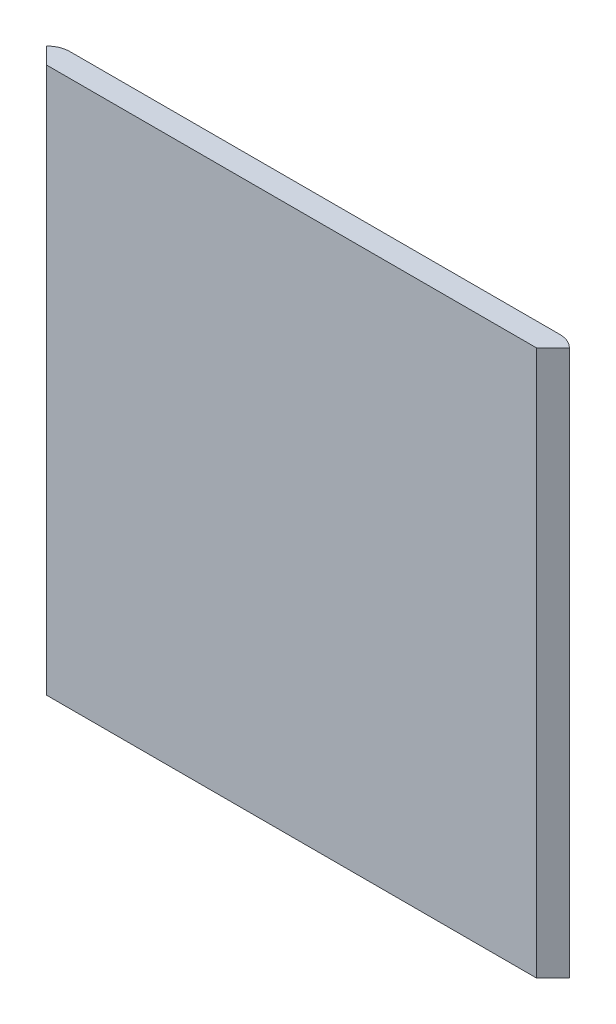
ISO-10303-21;
HEADER;
FILE_DESCRIPTION(('STEP AP214'),'2;1');
FILE_NAME('part.step','',(''),(''),'','','');
FILE_SCHEMA(('AUTOMOTIVE_DESIGN { 1 0 10303 214 1 1 1 1 }'));
ENDSEC;
DATA;
#1=APPLICATION_CONTEXT('core data for automotive mechanical design processes');
#2=APPLICATION_PROTOCOL_DEFINITION('international standard','automotive_design',2000,#1);
#3=PRODUCT_CONTEXT('',#1,'mechanical');
#4=PRODUCT('Part','Part','',(#3));
#5=PRODUCT_RELATED_PRODUCT_CATEGORY('part','',(#4));
#6=PRODUCT_DEFINITION_FORMATION('','',#4);
#7=PRODUCT_DEFINITION_CONTEXT('part definition',#1,'design');
#8=PRODUCT_DEFINITION('design','',#6,#7);
#9=PRODUCT_DEFINITION_SHAPE('','',#8);
#10=(LENGTH_UNIT() NAMED_UNIT(*) SI_UNIT(.MILLI.,.METRE.));
#11=(NAMED_UNIT(*) PLANE_ANGLE_UNIT() SI_UNIT($,.RADIAN.));
#12=(NAMED_UNIT(*) SI_UNIT($,.STERADIAN.) SOLID_ANGLE_UNIT());
#13=UNCERTAINTY_MEASURE_WITH_UNIT(LENGTH_MEASURE(1.E-05),#10,'distance_accuracy_value','');
#14=(GEOMETRIC_REPRESENTATION_CONTEXT(3) GLOBAL_UNCERTAINTY_ASSIGNED_CONTEXT((#13)) GLOBAL_UNIT_ASSIGNED_CONTEXT((#10,
#11,#12)) REPRESENTATION_CONTEXT('',''));
#15=CARTESIAN_POINT('',(0.,0.,0.));
#16=DIRECTION('',(0.,0.,1.));
#17=DIRECTION('',(1.,0.,0.));
#18=AXIS2_PLACEMENT_3D('',#15,#16,#17);
#19=CARTESIAN_POINT('',(0.,-58.5,0.));
#20=DIRECTION('',(0.,-1.,0.));
#21=DIRECTION('',(0.,0.,-1.));
#22=AXIS2_PLACEMENT_3D('',#19,#20,#21);
#23=PLANE('',#22);
#24=CARTESIAN_POINT('',(-52.5,-58.5,5.00000000000001));
#25=DIRECTION('',(0.,-1.,0.));
#26=DIRECTION('',(0.,0.,-1.));
#27=AXIS2_PLACEMENT_3D('',#24,#25,#26);
#28=CIRCLE('',#27,5.);
#29=CARTESIAN_POINT('',(-52.5,-58.5,0.));
#30=VERTEX_POINT('',#29);
#31=CARTESIAN_POINT('',(-56.0355339059327,-58.5,1.46446609406727));
#32=VERTEX_POINT('',#31);
#33=EDGE_CURVE('E134',#30,#32,#28,.F.);
#34=ORIENTED_EDGE('',*,*,#33,.F.);
#35=DIRECTION('',(1.,0.,0.));
#36=VECTOR('',#35,1.);
#37=CARTESIAN_POINT('',(-52.5,-58.5,0.));
#38=LINE('',#37,#36);
#39=CARTESIAN_POINT('',(52.5,-58.5,0.));
#40=VERTEX_POINT('',#39);
#41=EDGE_CURVE('E144',#30,#40,#38,.T.);
#42=ORIENTED_EDGE('',*,*,#41,.T.);
#43=CARTESIAN_POINT('',(52.5,-58.5,5.00000000000001));
#44=DIRECTION('',(0.,1.,0.));
#45=DIRECTION('',(0.,0.,-1.));
#46=AXIS2_PLACEMENT_3D('',#43,#44,#45);
#47=CIRCLE('',#46,5.);
#48=CARTESIAN_POINT('',(56.0355339059327,-58.5,1.46446609406727));
#49=VERTEX_POINT('',#48);
#50=EDGE_CURVE('E112',#40,#49,#47,.F.);
#51=ORIENTED_EDGE('',*,*,#50,.T.);
#52=DIRECTION('',(-0.707106781186547,0.,0.707106781186548));
#53=VECTOR('',#52,1.);
#54=CARTESIAN_POINT('',(28.75,-58.5,28.75));
#55=LINE('',#54,#53);
#56=CARTESIAN_POINT('',(52.5,-58.5,5.));
#57=VERTEX_POINT('',#56);
#58=EDGE_CURVE('E117',#49,#57,#55,.T.);
#59=ORIENTED_EDGE('',*,*,#58,.T.);
#60=DIRECTION('',(1.,0.,0.));
#61=VECTOR('',#60,1.);
#62=CARTESIAN_POINT('',(-52.5,-58.5,5.));
#63=LINE('',#62,#61);
#64=CARTESIAN_POINT('',(-52.5,-58.5,5.));
#65=VERTEX_POINT('',#64);
#66=EDGE_CURVE('E99',#65,#57,#63,.T.);
#67=ORIENTED_EDGE('',*,*,#66,.F.);
#68=DIRECTION('',(0.707106781186547,0.,0.707106781186548));
#69=VECTOR('',#68,1.);
#70=CARTESIAN_POINT('',(-28.75,-58.5,28.75));
#71=LINE('',#70,#69);
#72=EDGE_CURVE('E140',#32,#65,#71,.T.);
#73=ORIENTED_EDGE('',*,*,#72,.F.);
#74=EDGE_LOOP('',(#34,#42,#51,#59,#67,#73));
#75=FACE_BOUND('',#74,.T.);
#76=ADVANCED_FACE('F47',(#75),#23,.T.);
#77=CARTESIAN_POINT('',(-28.75,64.623724356958,28.75));
#78=DIRECTION('',(0.707106781186548,0.,-0.707106781186547));
#79=DIRECTION('',(-0.707106781186547,0.,-0.707106781186548));
#80=AXIS2_PLACEMENT_3D('',#77,#78,#79);
#81=PLANE('',#80);
#82=DIRECTION('',(0.,-1.,0.));
#83=VECTOR('',#82,1.);
#84=CARTESIAN_POINT('',(-52.5,-58.5,5.));
#85=LINE('',#84,#83);
#86=CARTESIAN_POINT('',(-52.5,58.5,5.));
#87=VERTEX_POINT('',#86);
#88=EDGE_CURVE('E110',#87,#65,#85,.T.);
#89=ORIENTED_EDGE('',*,*,#88,.F.);
#90=DIRECTION('',(-0.707106781186547,0.,-0.707106781186548));
#91=VECTOR('',#90,1.);
#92=CARTESIAN_POINT('',(-28.75,58.5,28.75));
#93=LINE('',#92,#91);
#94=CARTESIAN_POINT('',(-56.0355339059327,58.5,1.46446609406727));
#95=VERTEX_POINT('',#94);
#96=EDGE_CURVE('E59',#87,#95,#93,.T.);
#97=ORIENTED_EDGE('',*,*,#96,.T.);
#98=DIRECTION('',(0.,-1.,0.));
#99=VECTOR('',#98,1.);
#100=CARTESIAN_POINT('',(-56.0355339059327,64.623724356958,1.46446609406727));
#101=LINE('',#100,#99);
#102=EDGE_CURVE('E52',#95,#32,#101,.T.);
#103=ORIENTED_EDGE('',*,*,#102,.T.);
#104=ORIENTED_EDGE('',*,*,#72,.T.);
#105=EDGE_LOOP('',(#89,#97,#103,#104));
#106=FACE_BOUND('',#105,.T.);
#107=ADVANCED_FACE('F139',(#106),#81,.F.);
#108=CARTESIAN_POINT('',(-52.5,64.623724356958,5.00000000000001));
#109=DIRECTION('',(0.,-1.,0.));
#110=DIRECTION('',(0.,0.,-1.));
#111=AXIS2_PLACEMENT_3D('',#108,#109,#110);
#112=CYLINDRICAL_SURFACE('',#111,5.);
#113=ORIENTED_EDGE('',*,*,#102,.F.);
#114=CARTESIAN_POINT('',(-52.5,58.5,5.00000000000001));
#115=DIRECTION('',(0.,-1.,0.));
#116=DIRECTION('',(0.,0.,-1.));
#117=AXIS2_PLACEMENT_3D('',#114,#115,#116);
#118=CIRCLE('',#117,5.);
#119=CARTESIAN_POINT('',(-52.5,58.5,0.));
#120=VERTEX_POINT('',#119);
#121=EDGE_CURVE('E11',#95,#120,#118,.T.);
#122=ORIENTED_EDGE('',*,*,#121,.T.);
#123=DIRECTION('',(0.,-1.,0.));
#124=VECTOR('',#123,1.);
#125=CARTESIAN_POINT('',(-52.5,-58.5,0.));
#126=LINE('',#125,#124);
#127=EDGE_CURVE('E142',#120,#30,#126,.T.);
#128=ORIENTED_EDGE('',*,*,#127,.T.);
#129=ORIENTED_EDGE('',*,*,#33,.T.);
#130=EDGE_LOOP('',(#113,#122,#128,#129));
#131=FACE_BOUND('',#130,.T.);
#132=ADVANCED_FACE('F51',(#131),#112,.T.);
#133=CARTESIAN_POINT('',(-52.5,58.5,5.));
#134=DIRECTION('',(0.,-1.,0.));
#135=DIRECTION('',(0.,0.,-1.));
#136=AXIS2_PLACEMENT_3D('',#133,#134,#135);
#137=PLANE('',#136);
#138=ORIENTED_EDGE('',*,*,#96,.F.);
#139=DIRECTION('',(-1.,0.,0.));
#140=VECTOR('',#139,1.);
#141=CARTESIAN_POINT('',(-52.5,58.5,5.));
#142=LINE('',#141,#140);
#143=CARTESIAN_POINT('',(52.5,58.5,5.));
#144=VERTEX_POINT('',#143);
#145=EDGE_CURVE('E147',#144,#87,#142,.T.);
#146=ORIENTED_EDGE('',*,*,#145,.F.);
#147=DIRECTION('',(0.707106781186547,0.,-0.707106781186548));
#148=VECTOR('',#147,1.);
#149=CARTESIAN_POINT('',(28.75,58.5,28.75));
#150=LINE('',#149,#148);
#151=CARTESIAN_POINT('',(56.0355339059327,58.5,1.46446609406727));
#152=VERTEX_POINT('',#151);
#153=EDGE_CURVE('E121',#144,#152,#150,.T.);
#154=ORIENTED_EDGE('',*,*,#153,.T.);
#155=CARTESIAN_POINT('',(52.5,58.5,5.00000000000001));
#156=DIRECTION('',(0.,1.,0.));
#157=DIRECTION('',(0.,0.,-1.));
#158=AXIS2_PLACEMENT_3D('',#155,#156,#157);
#159=CIRCLE('',#158,5.);
#160=CARTESIAN_POINT('',(52.5,58.5,0.));
#161=VERTEX_POINT('',#160);
#162=EDGE_CURVE('E137',#152,#161,#159,.T.);
#163=ORIENTED_EDGE('',*,*,#162,.T.);
#164=DIRECTION('',(-1.,0.,0.));
#165=VECTOR('',#164,1.);
#166=CARTESIAN_POINT('',(-52.5,58.5,0.));
#167=LINE('',#166,#165);
#168=EDGE_CURVE('E148',#161,#120,#167,.T.);
#169=ORIENTED_EDGE('',*,*,#168,.T.);
#170=ORIENTED_EDGE('',*,*,#121,.F.);
#171=EDGE_LOOP('',(#138,#146,#154,#163,#169,#170));
#172=FACE_BOUND('',#171,.T.);
#173=ADVANCED_FACE('F156',(#172),#137,.F.);
#174=CARTESIAN_POINT('',(28.75,64.623724356958,28.75));
#175=DIRECTION('',(-0.707106781186548,0.,-0.707106781186547));
#176=DIRECTION('',(0.707106781186547,0.,-0.707106781186548));
#177=AXIS2_PLACEMENT_3D('',#174,#175,#176);
#178=PLANE('',#177);
#179=DIRECTION('',(0.,-1.,0.));
#180=VECTOR('',#179,1.);
#181=CARTESIAN_POINT('',(52.5,64.623724356958,5.));
#182=LINE('',#181,#180);
#183=EDGE_CURVE('E102',#144,#57,#182,.T.);
#184=ORIENTED_EDGE('',*,*,#183,.T.);
#185=ORIENTED_EDGE('',*,*,#58,.F.);
#186=DIRECTION('',(0.,-1.,0.));
#187=VECTOR('',#186,1.);
#188=CARTESIAN_POINT('',(56.0355339059327,64.623724356958,1.46446609406727));
#189=LINE('',#188,#187);
#190=EDGE_CURVE('E125',#152,#49,#189,.T.);
#191=ORIENTED_EDGE('',*,*,#190,.F.);
#192=ORIENTED_EDGE('',*,*,#153,.F.);
#193=EDGE_LOOP('',(#184,#185,#191,#192));
#194=FACE_BOUND('',#193,.T.);
#195=ADVANCED_FACE('F116',(#194),#178,.F.);
#196=CARTESIAN_POINT('',(52.5,64.623724356958,5.00000000000001));
#197=DIRECTION('',(0.,-1.,0.));
#198=DIRECTION('',(0.,0.,-1.));
#199=AXIS2_PLACEMENT_3D('',#196,#197,#198);
#200=CYLINDRICAL_SURFACE('',#199,5.);
#201=ORIENTED_EDGE('',*,*,#190,.T.);
#202=ORIENTED_EDGE('',*,*,#50,.F.);
#203=DIRECTION('',(0.,-1.,0.));
#204=VECTOR('',#203,1.);
#205=CARTESIAN_POINT('',(52.5,64.623724356958,0.));
#206=LINE('',#205,#204);
#207=EDGE_CURVE('E122',#161,#40,#206,.T.);
#208=ORIENTED_EDGE('',*,*,#207,.F.);
#209=ORIENTED_EDGE('',*,*,#162,.F.);
#210=EDGE_LOOP('',(#201,#202,#208,#209));
#211=FACE_BOUND('',#210,.T.);
#212=ADVANCED_FACE('F158',(#211),#200,.T.);
#213=CARTESIAN_POINT('',(0.,0.,5.));
#214=DIRECTION('',(0.,0.,-1.));
#215=DIRECTION('',(-1.,0.,0.));
#216=AXIS2_PLACEMENT_3D('',#213,#214,#215);
#217=PLANE('',#216);
#218=ORIENTED_EDGE('',*,*,#183,.F.);
#219=ORIENTED_EDGE('',*,*,#145,.T.);
#220=ORIENTED_EDGE('',*,*,#88,.T.);
#221=ORIENTED_EDGE('',*,*,#66,.T.);
#222=EDGE_LOOP('',(#218,#219,#220,#221));
#223=FACE_BOUND('',#222,.T.);
#224=ADVANCED_FACE('F105',(#223),#217,.F.);
#225=CARTESIAN_POINT('',(0.,0.,0.));
#226=DIRECTION('',(0.,0.,-1.));
#227=DIRECTION('',(-1.,0.,0.));
#228=AXIS2_PLACEMENT_3D('',#225,#226,#227);
#229=PLANE('',#228);
#230=ORIENTED_EDGE('',*,*,#207,.T.);
#231=ORIENTED_EDGE('',*,*,#41,.F.);
#232=ORIENTED_EDGE('',*,*,#127,.F.);
#233=ORIENTED_EDGE('',*,*,#168,.F.);
#234=EDGE_LOOP('',(#230,#231,#232,#233));
#235=FACE_BOUND('',#234,.T.);
#236=ADVANCED_FACE('F146',(#235),#229,.T.);
#237=CLOSED_SHELL('',(#76,#107,#132,#173,#195,#212,#224,#236));
#238=MANIFOLD_SOLID_BREP('B2',#237);
#239=ADVANCED_BREP_SHAPE_REPRESENTATION('',(#18,#238),#14);
#240=SHAPE_DEFINITION_REPRESENTATION(#9,#239);
ENDSEC;
END-ISO-10303-21;
